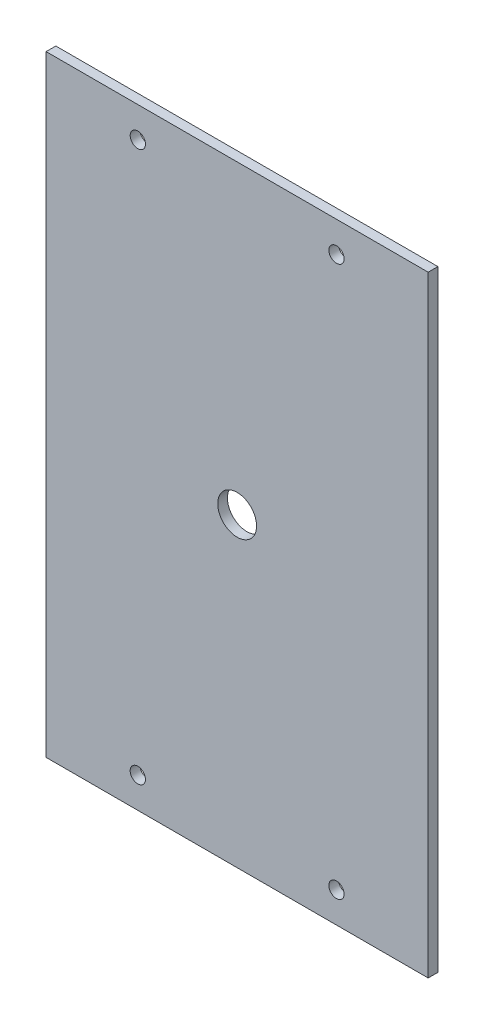
ISO-10303-21;
HEADER;
FILE_DESCRIPTION(('STEP AP214'),'2;1');
FILE_NAME('part.step','',(''),(''),'','','');
FILE_SCHEMA(('AUTOMOTIVE_DESIGN { 1 0 10303 214 1 1 1 1 }'));
ENDSEC;
DATA;
#1=APPLICATION_CONTEXT('core data for automotive mechanical design processes');
#2=APPLICATION_PROTOCOL_DEFINITION('international standard','automotive_design',2000,#1);
#3=PRODUCT_CONTEXT('',#1,'mechanical');
#4=PRODUCT('Part','Part','',(#3));
#5=PRODUCT_RELATED_PRODUCT_CATEGORY('part','',(#4));
#6=PRODUCT_DEFINITION_FORMATION('','',#4);
#7=PRODUCT_DEFINITION_CONTEXT('part definition',#1,'design');
#8=PRODUCT_DEFINITION('design','',#6,#7);
#9=PRODUCT_DEFINITION_SHAPE('','',#8);
#10=(LENGTH_UNIT() NAMED_UNIT(*) SI_UNIT(.MILLI.,.METRE.));
#11=(NAMED_UNIT(*) PLANE_ANGLE_UNIT() SI_UNIT($,.RADIAN.));
#12=(NAMED_UNIT(*) SI_UNIT($,.STERADIAN.) SOLID_ANGLE_UNIT());
#13=UNCERTAINTY_MEASURE_WITH_UNIT(LENGTH_MEASURE(1.E-05),#10,'distance_accuracy_value','');
#14=(GEOMETRIC_REPRESENTATION_CONTEXT(3) GLOBAL_UNCERTAINTY_ASSIGNED_CONTEXT((#13)) GLOBAL_UNIT_ASSIGNED_CONTEXT((#10,
#11,#12)) REPRESENTATION_CONTEXT('',''));
#15=CARTESIAN_POINT('',(0.,0.,0.));
#16=DIRECTION('',(0.,0.,1.));
#17=DIRECTION('',(1.,0.,0.));
#18=AXIS2_PLACEMENT_3D('',#15,#16,#17);
#19=CARTESIAN_POINT('',(-125.,200.,3.175));
#20=DIRECTION('',(1.,0.,0.));
#21=DIRECTION('',(0.,1.,0.));
#22=AXIS2_PLACEMENT_3D('',#19,#20,#21);
#23=PLANE('',#22);
#24=DIRECTION('',(0.,-1.,0.));
#25=VECTOR('',#24,1.);
#26=CARTESIAN_POINT('',(-125.,200.,0.));
#27=LINE('',#26,#25);
#28=CARTESIAN_POINT('',(-125.,200.,0.));
#29=VERTEX_POINT('',#28);
#30=CARTESIAN_POINT('',(-125.,0.,0.));
#31=VERTEX_POINT('',#30);
#32=EDGE_CURVE('E100',#29,#31,#27,.T.);
#33=ORIENTED_EDGE('',*,*,#32,.T.);
#34=DIRECTION('',(0.,0.,-1.));
#35=VECTOR('',#34,1.);
#36=CARTESIAN_POINT('',(-125.,0.,3.175));
#37=LINE('',#36,#35);
#38=CARTESIAN_POINT('',(-125.,0.,3.175));
#39=VERTEX_POINT('',#38);
#40=EDGE_CURVE('E11',#39,#31,#37,.T.);
#41=ORIENTED_EDGE('',*,*,#40,.F.);
#42=DIRECTION('',(0.,-1.,0.));
#43=VECTOR('',#42,1.);
#44=CARTESIAN_POINT('',(-125.,200.,3.175));
#45=LINE('',#44,#43);
#46=CARTESIAN_POINT('',(-125.,200.,3.175));
#47=VERTEX_POINT('',#46);
#48=EDGE_CURVE('E88',#47,#39,#45,.T.);
#49=ORIENTED_EDGE('',*,*,#48,.F.);
#50=DIRECTION('',(0.,0.,-1.));
#51=VECTOR('',#50,1.);
#52=CARTESIAN_POINT('',(-125.,200.,3.175));
#53=LINE('',#52,#51);
#54=EDGE_CURVE('E96',#47,#29,#53,.T.);
#55=ORIENTED_EDGE('',*,*,#54,.T.);
#56=EDGE_LOOP('',(#33,#41,#49,#55));
#57=FACE_BOUND('',#56,.T.);
#58=ADVANCED_FACE('F37',(#57),#23,.F.);
#59=CARTESIAN_POINT('',(-125.,0.,3.175));
#60=DIRECTION('',(0.,1.,0.));
#61=DIRECTION('',(0.,0.,1.));
#62=AXIS2_PLACEMENT_3D('',#59,#60,#61);
#63=PLANE('',#62);
#64=DIRECTION('',(1.,0.,0.));
#65=VECTOR('',#64,1.);
#66=CARTESIAN_POINT('',(-125.,0.,0.));
#67=LINE('',#66,#65);
#68=CARTESIAN_POINT('',(0.,0.,0.));
#69=VERTEX_POINT('',#68);
#70=EDGE_CURVE('E92',#31,#69,#67,.T.);
#71=ORIENTED_EDGE('',*,*,#70,.T.);
#72=DIRECTION('',(0.,0.,-1.));
#73=VECTOR('',#72,1.);
#74=CARTESIAN_POINT('',(0.,0.,3.175));
#75=LINE('',#74,#73);
#76=CARTESIAN_POINT('',(0.,0.,3.175));
#77=VERTEX_POINT('',#76);
#78=EDGE_CURVE('E45',#77,#69,#75,.T.);
#79=ORIENTED_EDGE('',*,*,#78,.F.);
#80=DIRECTION('',(1.,0.,0.));
#81=VECTOR('',#80,1.);
#82=CARTESIAN_POINT('',(-125.,0.,3.175));
#83=LINE('',#82,#81);
#84=EDGE_CURVE('E83',#39,#77,#83,.T.);
#85=ORIENTED_EDGE('',*,*,#84,.F.);
#86=ORIENTED_EDGE('',*,*,#40,.T.);
#87=EDGE_LOOP('',(#71,#79,#85,#86));
#88=FACE_BOUND('',#87,.T.);
#89=ADVANCED_FACE('F91',(#88),#63,.F.);
#90=CARTESIAN_POINT('',(0.,200.,3.175));
#91=DIRECTION('',(-1.,0.,0.));
#92=DIRECTION('',(0.,0.,1.));
#93=AXIS2_PLACEMENT_3D('',#90,#91,#92);
#94=PLANE('',#93);
#95=DIRECTION('',(0.,1.,0.));
#96=VECTOR('',#95,1.);
#97=CARTESIAN_POINT('',(0.,200.,0.));
#98=LINE('',#97,#96);
#99=CARTESIAN_POINT('',(0.,200.,0.));
#100=VERTEX_POINT('',#99);
#101=EDGE_CURVE('E70',#69,#100,#98,.T.);
#102=ORIENTED_EDGE('',*,*,#101,.T.);
#103=DIRECTION('',(0.,0.,-1.));
#104=VECTOR('',#103,1.);
#105=CARTESIAN_POINT('',(0.,200.,3.175));
#106=LINE('',#105,#104);
#107=CARTESIAN_POINT('',(0.,200.,3.175));
#108=VERTEX_POINT('',#107);
#109=EDGE_CURVE('E93',#108,#100,#106,.T.);
#110=ORIENTED_EDGE('',*,*,#109,.F.);
#111=DIRECTION('',(0.,1.,0.));
#112=VECTOR('',#111,1.);
#113=CARTESIAN_POINT('',(0.,200.,3.175));
#114=LINE('',#113,#112);
#115=EDGE_CURVE('E86',#77,#108,#114,.T.);
#116=ORIENTED_EDGE('',*,*,#115,.F.);
#117=ORIENTED_EDGE('',*,*,#78,.T.);
#118=EDGE_LOOP('',(#102,#110,#116,#117));
#119=FACE_BOUND('',#118,.T.);
#120=ADVANCED_FACE('F94',(#119),#94,.F.);
#121=CARTESIAN_POINT('',(-125.,200.,3.175));
#122=DIRECTION('',(0.,-1.,0.));
#123=DIRECTION('',(0.,0.,-1.));
#124=AXIS2_PLACEMENT_3D('',#121,#122,#123);
#125=PLANE('',#124);
#126=DIRECTION('',(-1.,0.,0.));
#127=VECTOR('',#126,1.);
#128=CARTESIAN_POINT('',(-125.,200.,0.));
#129=LINE('',#128,#127);
#130=EDGE_CURVE('E76',#100,#29,#129,.T.);
#131=ORIENTED_EDGE('',*,*,#130,.T.);
#132=ORIENTED_EDGE('',*,*,#54,.F.);
#133=DIRECTION('',(-1.,0.,0.));
#134=VECTOR('',#133,1.);
#135=CARTESIAN_POINT('',(-125.,200.,3.175));
#136=LINE('',#135,#134);
#137=EDGE_CURVE('E53',#108,#47,#136,.T.);
#138=ORIENTED_EDGE('',*,*,#137,.F.);
#139=ORIENTED_EDGE('',*,*,#109,.T.);
#140=EDGE_LOOP('',(#131,#132,#138,#139));
#141=FACE_BOUND('',#140,.T.);
#142=ADVANCED_FACE('F108',(#141),#125,.F.);
#143=CARTESIAN_POINT('',(0.,0.,3.175));
#144=DIRECTION('',(0.,0.,1.));
#145=DIRECTION('',(1.,0.,0.));
#146=AXIS2_PLACEMENT_3D('',#143,#144,#145);
#147=PLANE('',#146);
#148=CARTESIAN_POINT('',(-62.5,100.,3.175));
#149=DIRECTION('',(0.,0.,1.));
#150=DIRECTION('',(1.,0.,0.));
#151=AXIS2_PLACEMENT_3D('',#148,#149,#150);
#152=CIRCLE('',#151,6.35);
#153=CARTESIAN_POINT('',(-56.15,100.,3.175));
#154=VERTEX_POINT('',#153);
#155=EDGE_CURVE('E140',#154,#154,#152,.T.);
#156=ORIENTED_EDGE('',*,*,#155,.F.);
#157=EDGE_LOOP('',(#156));
#158=FACE_BOUND('',#157,.T.);
#159=CARTESIAN_POINT('',(-95.,10.0000000000001,3.175));
#160=DIRECTION('',(0.,0.,-1.));
#161=DIRECTION('',(1.,0.,0.));
#162=AXIS2_PLACEMENT_3D('',#159,#160,#161);
#163=CIRCLE('',#162,2.5);
#164=CARTESIAN_POINT('',(-92.5,10.0000000000001,3.175));
#165=VERTEX_POINT('',#164);
#166=EDGE_CURVE('E129',#165,#165,#163,.T.);
#167=ORIENTED_EDGE('',*,*,#166,.T.);
#168=EDGE_LOOP('',(#167));
#169=FACE_BOUND('',#168,.T.);
#170=CARTESIAN_POINT('',(-30.,10.0000000000001,3.175));
#171=DIRECTION('',(0.,0.,-1.));
#172=DIRECTION('',(1.,0.,0.));
#173=AXIS2_PLACEMENT_3D('',#170,#171,#172);
#174=CIRCLE('',#173,2.5);
#175=CARTESIAN_POINT('',(-27.5,10.0000000000001,3.175));
#176=VERTEX_POINT('',#175);
#177=EDGE_CURVE('E130',#176,#176,#174,.T.);
#178=ORIENTED_EDGE('',*,*,#177,.T.);
#179=EDGE_LOOP('',(#178));
#180=FACE_BOUND('',#179,.T.);
#181=CARTESIAN_POINT('',(-95.,190.,3.175));
#182=DIRECTION('',(0.,0.,1.));
#183=DIRECTION('',(1.,0.,0.));
#184=AXIS2_PLACEMENT_3D('',#181,#182,#183);
#185=CIRCLE('',#184,2.5);
#186=CARTESIAN_POINT('',(-92.5,190.,3.175));
#187=VERTEX_POINT('',#186);
#188=EDGE_CURVE('E117',#187,#187,#185,.T.);
#189=ORIENTED_EDGE('',*,*,#188,.F.);
#190=EDGE_LOOP('',(#189));
#191=FACE_BOUND('',#190,.T.);
#192=CARTESIAN_POINT('',(-30.,190.,3.175));
#193=DIRECTION('',(0.,0.,1.));
#194=DIRECTION('',(1.,0.,0.));
#195=AXIS2_PLACEMENT_3D('',#192,#193,#194);
#196=CIRCLE('',#195,2.5);
#197=CARTESIAN_POINT('',(-27.5,190.,3.175));
#198=VERTEX_POINT('',#197);
#199=EDGE_CURVE('E114',#198,#198,#196,.T.);
#200=ORIENTED_EDGE('',*,*,#199,.F.);
#201=EDGE_LOOP('',(#200));
#202=FACE_BOUND('',#201,.T.);
#203=ORIENTED_EDGE('',*,*,#48,.T.);
#204=ORIENTED_EDGE('',*,*,#84,.T.);
#205=ORIENTED_EDGE('',*,*,#115,.T.);
#206=ORIENTED_EDGE('',*,*,#137,.T.);
#207=EDGE_LOOP('',(#203,#204,#205,#206));
#208=FACE_BOUND('',#207,.T.);
#209=ADVANCED_FACE('F84',(#158,#169,#180,#191,#202,#208),#147,.T.);
#210=CARTESIAN_POINT('',(0.,0.,0.));
#211=DIRECTION('',(0.,0.,1.));
#212=DIRECTION('',(1.,0.,0.));
#213=AXIS2_PLACEMENT_3D('',#210,#211,#212);
#214=PLANE('',#213);
#215=CARTESIAN_POINT('',(-62.5,100.,0.));
#216=DIRECTION('',(0.,0.,1.));
#217=DIRECTION('',(1.,0.,0.));
#218=AXIS2_PLACEMENT_3D('',#215,#216,#217);
#219=CIRCLE('',#218,6.35);
#220=CARTESIAN_POINT('',(-56.15,100.,0.));
#221=VERTEX_POINT('',#220);
#222=EDGE_CURVE('E133',#221,#221,#219,.F.);
#223=ORIENTED_EDGE('',*,*,#222,.F.);
#224=EDGE_LOOP('',(#223));
#225=FACE_BOUND('',#224,.T.);
#226=CARTESIAN_POINT('',(-95.,10.0000000000001,0.));
#227=DIRECTION('',(0.,0.,1.));
#228=DIRECTION('',(1.,0.,0.));
#229=AXIS2_PLACEMENT_3D('',#226,#227,#228);
#230=CIRCLE('',#229,2.5);
#231=CARTESIAN_POINT('',(-92.5,10.0000000000001,0.));
#232=VERTEX_POINT('',#231);
#233=EDGE_CURVE('E121',#232,#232,#230,.T.);
#234=ORIENTED_EDGE('',*,*,#233,.T.);
#235=EDGE_LOOP('',(#234));
#236=FACE_BOUND('',#235,.T.);
#237=CARTESIAN_POINT('',(-30.,10.0000000000001,0.));
#238=DIRECTION('',(0.,0.,1.));
#239=DIRECTION('',(1.,0.,0.));
#240=AXIS2_PLACEMENT_3D('',#237,#238,#239);
#241=CIRCLE('',#240,2.5);
#242=CARTESIAN_POINT('',(-27.5,10.0000000000001,0.));
#243=VERTEX_POINT('',#242);
#244=EDGE_CURVE('E126',#243,#243,#241,.T.);
#245=ORIENTED_EDGE('',*,*,#244,.T.);
#246=EDGE_LOOP('',(#245));
#247=FACE_BOUND('',#246,.T.);
#248=CARTESIAN_POINT('',(-95.,190.,0.));
#249=DIRECTION('',(0.,0.,1.));
#250=DIRECTION('',(1.,0.,0.));
#251=AXIS2_PLACEMENT_3D('',#248,#249,#250);
#252=CIRCLE('',#251,2.5);
#253=CARTESIAN_POINT('',(-92.5,190.,0.));
#254=VERTEX_POINT('',#253);
#255=EDGE_CURVE('E103',#254,#254,#252,.F.);
#256=ORIENTED_EDGE('',*,*,#255,.F.);
#257=EDGE_LOOP('',(#256));
#258=FACE_BOUND('',#257,.T.);
#259=CARTESIAN_POINT('',(-30.,190.,0.));
#260=DIRECTION('',(0.,0.,1.));
#261=DIRECTION('',(1.,0.,0.));
#262=AXIS2_PLACEMENT_3D('',#259,#260,#261);
#263=CIRCLE('',#262,2.5);
#264=CARTESIAN_POINT('',(-27.5,190.,0.));
#265=VERTEX_POINT('',#264);
#266=EDGE_CURVE('E118',#265,#265,#263,.F.);
#267=ORIENTED_EDGE('',*,*,#266,.F.);
#268=EDGE_LOOP('',(#267));
#269=FACE_BOUND('',#268,.T.);
#270=ORIENTED_EDGE('',*,*,#32,.F.);
#271=ORIENTED_EDGE('',*,*,#130,.F.);
#272=ORIENTED_EDGE('',*,*,#101,.F.);
#273=ORIENTED_EDGE('',*,*,#70,.F.);
#274=EDGE_LOOP('',(#270,#271,#272,#273));
#275=FACE_BOUND('',#274,.T.);
#276=ADVANCED_FACE('F111',(#225,#236,#247,#258,#269,#275),#214,.F.);
#277=CARTESIAN_POINT('',(-30.,190.,-7.07106781186548));
#278=DIRECTION('',(0.,0.,1.));
#279=DIRECTION('',(1.,0.,0.));
#280=AXIS2_PLACEMENT_3D('',#277,#278,#279);
#281=CYLINDRICAL_SURFACE('',#280,2.5);
#282=ORIENTED_EDGE('',*,*,#266,.T.);
#283=EDGE_LOOP('',(#282));
#284=FACE_BOUND('',#283,.T.);
#285=ORIENTED_EDGE('',*,*,#199,.T.);
#286=EDGE_LOOP('',(#285));
#287=FACE_BOUND('',#286,.T.);
#288=ADVANCED_FACE('F157',(#284,#287),#281,.F.);
#289=CARTESIAN_POINT('',(-95.,190.,-7.07106781186548));
#290=DIRECTION('',(0.,0.,1.));
#291=DIRECTION('',(1.,0.,0.));
#292=AXIS2_PLACEMENT_3D('',#289,#290,#291);
#293=CYLINDRICAL_SURFACE('',#292,2.5);
#294=ORIENTED_EDGE('',*,*,#255,.T.);
#295=EDGE_LOOP('',(#294));
#296=FACE_BOUND('',#295,.T.);
#297=ORIENTED_EDGE('',*,*,#188,.T.);
#298=EDGE_LOOP('',(#297));
#299=FACE_BOUND('',#298,.T.);
#300=ADVANCED_FACE('F159',(#296,#299),#293,.F.);
#301=CARTESIAN_POINT('',(-30.,10.0000000000001,-7.07106781186547));
#302=DIRECTION('',(0.,0.,1.));
#303=DIRECTION('',(1.,0.,0.));
#304=AXIS2_PLACEMENT_3D('',#301,#302,#303);
#305=CYLINDRICAL_SURFACE('',#304,2.5);
#306=ORIENTED_EDGE('',*,*,#244,.F.);
#307=EDGE_LOOP('',(#306));
#308=FACE_BOUND('',#307,.T.);
#309=ORIENTED_EDGE('',*,*,#177,.F.);
#310=EDGE_LOOP('',(#309));
#311=FACE_BOUND('',#310,.T.);
#312=ADVANCED_FACE('F166',(#308,#311),#305,.F.);
#313=CARTESIAN_POINT('',(-95.,10.0000000000001,-7.07106781186547));
#314=DIRECTION('',(0.,0.,1.));
#315=DIRECTION('',(1.,0.,0.));
#316=AXIS2_PLACEMENT_3D('',#313,#314,#315);
#317=CYLINDRICAL_SURFACE('',#316,2.5);
#318=ORIENTED_EDGE('',*,*,#233,.F.);
#319=EDGE_LOOP('',(#318));
#320=FACE_BOUND('',#319,.T.);
#321=ORIENTED_EDGE('',*,*,#166,.F.);
#322=EDGE_LOOP('',(#321));
#323=FACE_BOUND('',#322,.T.);
#324=ADVANCED_FACE('F207',(#320,#323),#317,.F.);
#325=CARTESIAN_POINT('',(-62.5,100.,-17.9605122421383));
#326=DIRECTION('',(0.,0.,1.));
#327=DIRECTION('',(1.,0.,0.));
#328=AXIS2_PLACEMENT_3D('',#325,#326,#327);
#329=CYLINDRICAL_SURFACE('',#328,6.35);
#330=ORIENTED_EDGE('',*,*,#222,.T.);
#331=EDGE_LOOP('',(#330));
#332=FACE_BOUND('',#331,.T.);
#333=ORIENTED_EDGE('',*,*,#155,.T.);
#334=EDGE_LOOP('',(#333));
#335=FACE_BOUND('',#334,.T.);
#336=ADVANCED_FACE('F144',(#332,#335),#329,.F.);
#337=CLOSED_SHELL('',(#58,#89,#120,#142,#209,#276,#288,#300,#312,#324,#336));
#338=MANIFOLD_SOLID_BREP('B2',#337);
#339=ADVANCED_BREP_SHAPE_REPRESENTATION('',(#18,#338),#14);
#340=SHAPE_DEFINITION_REPRESENTATION(#9,#339);
ENDSEC;
END-ISO-10303-21;
